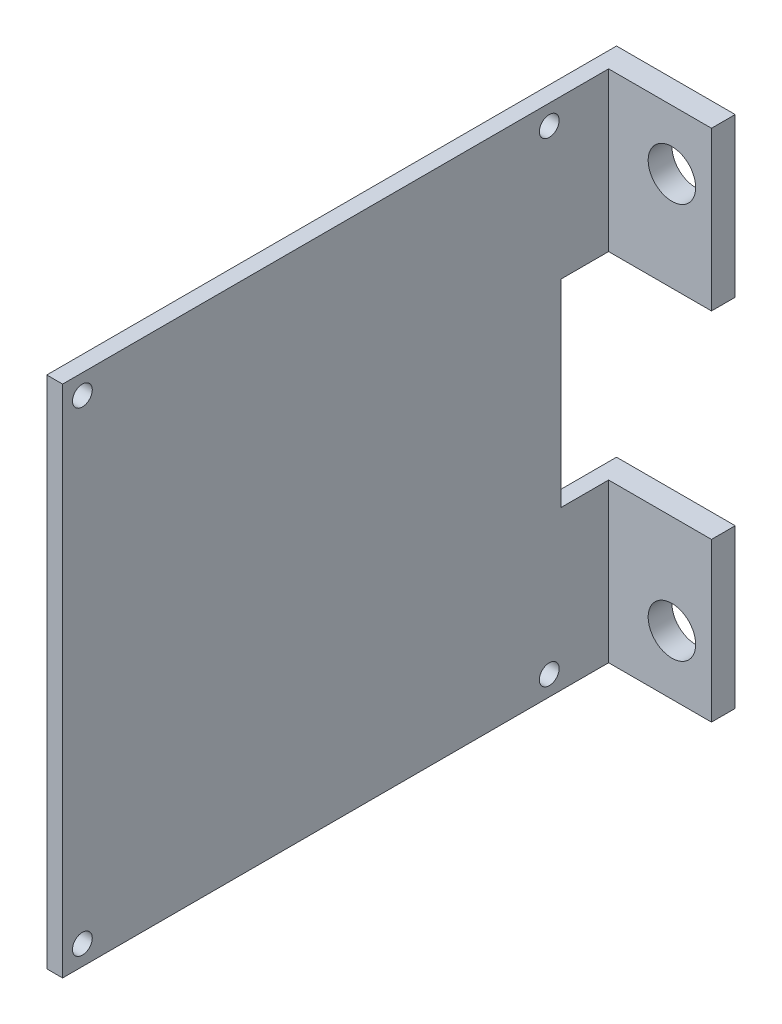
ISO-10303-21;
HEADER;
FILE_DESCRIPTION(('STEP AP214'),'2;1');
FILE_NAME('part.step','',(''),(''),'','','');
FILE_SCHEMA(('AUTOMOTIVE_DESIGN { 1 0 10303 214 1 1 1 1 }'));
ENDSEC;
DATA;
#1=APPLICATION_CONTEXT('core data for automotive mechanical design processes');
#2=APPLICATION_PROTOCOL_DEFINITION('international standard','automotive_design',2000,#1);
#3=PRODUCT_CONTEXT('',#1,'mechanical');
#4=PRODUCT('Part','Part','',(#3));
#5=PRODUCT_RELATED_PRODUCT_CATEGORY('part','',(#4));
#6=PRODUCT_DEFINITION_FORMATION('','',#4);
#7=PRODUCT_DEFINITION_CONTEXT('part definition',#1,'design');
#8=PRODUCT_DEFINITION('design','',#6,#7);
#9=PRODUCT_DEFINITION_SHAPE('','',#8);
#10=(LENGTH_UNIT() NAMED_UNIT(*) SI_UNIT(.MILLI.,.METRE.));
#11=(NAMED_UNIT(*) PLANE_ANGLE_UNIT() SI_UNIT($,.RADIAN.));
#12=(NAMED_UNIT(*) SI_UNIT($,.STERADIAN.) SOLID_ANGLE_UNIT());
#13=UNCERTAINTY_MEASURE_WITH_UNIT(LENGTH_MEASURE(1.E-05),#10,'distance_accuracy_value','');
#14=(GEOMETRIC_REPRESENTATION_CONTEXT(3) GLOBAL_UNCERTAINTY_ASSIGNED_CONTEXT((#13)) GLOBAL_UNIT_ASSIGNED_CONTEXT((#10,
#11,#12)) REPRESENTATION_CONTEXT('',''));
#15=CARTESIAN_POINT('',(0.,0.,0.));
#16=DIRECTION('',(0.,0.,1.));
#17=DIRECTION('',(1.,0.,0.));
#18=AXIS2_PLACEMENT_3D('',#15,#16,#17);
#19=CARTESIAN_POINT('',(0.,0.,3.));
#20=DIRECTION('',(0.,1.,0.));
#21=DIRECTION('',(0.,0.,1.));
#22=AXIS2_PLACEMENT_3D('',#19,#20,#21);
#23=PLANE('',#22);
#24=DIRECTION('',(1.,0.,0.));
#25=VECTOR('',#24,1.);
#26=CARTESIAN_POINT('',(0.,0.,0.));
#27=LINE('',#26,#25);
#28=CARTESIAN_POINT('',(0.,0.,0.));
#29=VERTEX_POINT('',#28);
#30=CARTESIAN_POINT('',(15.,0.,0.));
#31=VERTEX_POINT('',#30);
#32=EDGE_CURVE('E194',#29,#31,#27,.T.);
#33=ORIENTED_EDGE('',*,*,#32,.T.);
#34=DIRECTION('',(0.,0.,-1.));
#35=VECTOR('',#34,1.);
#36=CARTESIAN_POINT('',(15.,0.,3.));
#37=LINE('',#36,#35);
#38=CARTESIAN_POINT('',(15.,0.,3.));
#39=VERTEX_POINT('',#38);
#40=EDGE_CURVE('E11',#39,#31,#37,.T.);
#41=ORIENTED_EDGE('',*,*,#40,.F.);
#42=DIRECTION('',(1.,0.,0.));
#43=VECTOR('',#42,1.);
#44=CARTESIAN_POINT('',(0.,0.,3.));
#45=LINE('',#44,#43);
#46=CARTESIAN_POINT('',(2.,0.,3.));
#47=VERTEX_POINT('',#46);
#48=EDGE_CURVE('E204',#47,#39,#45,.T.);
#49=ORIENTED_EDGE('',*,*,#48,.F.);
#50=DIRECTION('',(0.,0.,-1.));
#51=VECTOR('',#50,1.);
#52=CARTESIAN_POINT('',(2.00000000000001,0.,72.));
#53=LINE('',#52,#51);
#54=CARTESIAN_POINT('',(2.00000000000001,0.,72.));
#55=VERTEX_POINT('',#54);
#56=EDGE_CURVE('E187',#55,#47,#53,.T.);
#57=ORIENTED_EDGE('',*,*,#56,.F.);
#58=DIRECTION('',(1.,0.,0.));
#59=VECTOR('',#58,1.);
#60=CARTESIAN_POINT('',(0.,0.,72.));
#61=LINE('',#60,#59);
#62=CARTESIAN_POINT('',(0.,0.,72.));
#63=VERTEX_POINT('',#62);
#64=EDGE_CURVE('E177',#63,#55,#61,.T.);
#65=ORIENTED_EDGE('',*,*,#64,.F.);
#66=DIRECTION('',(0.,0.,-1.));
#67=VECTOR('',#66,1.);
#68=CARTESIAN_POINT('',(0.,0.,3.));
#69=LINE('',#68,#67);
#70=EDGE_CURVE('E40',#63,#29,#69,.T.);
#71=ORIENTED_EDGE('',*,*,#70,.T.);
#72=EDGE_LOOP('',(#33,#41,#49,#57,#65,#71));
#73=FACE_BOUND('',#72,.T.);
#74=ADVANCED_FACE('F33',(#73),#23,.F.);
#75=CARTESIAN_POINT('',(0.,0.,3.));
#76=DIRECTION('',(0.,0.,1.));
#77=DIRECTION('',(1.,0.,0.));
#78=AXIS2_PLACEMENT_3D('',#75,#76,#77);
#79=PLANE('',#78);
#80=DIRECTION('',(0.,1.,0.));
#81=VECTOR('',#80,1.);
#82=CARTESIAN_POINT('',(2.,65.,3.));
#83=LINE('',#82,#81);
#84=CARTESIAN_POINT('',(2.00000000000001,20.,3.));
#85=VERTEX_POINT('',#84);
#86=EDGE_CURVE('E47',#47,#85,#83,.T.);
#87=ORIENTED_EDGE('',*,*,#86,.F.);
#88=ORIENTED_EDGE('',*,*,#48,.T.);
#89=DIRECTION('',(0.,1.,0.));
#90=VECTOR('',#89,1.);
#91=CARTESIAN_POINT('',(15.,0.,3.));
#92=LINE('',#91,#90);
#93=CARTESIAN_POINT('',(15.,20.,3.));
#94=VERTEX_POINT('',#93);
#95=EDGE_CURVE('E206',#39,#94,#92,.T.);
#96=ORIENTED_EDGE('',*,*,#95,.T.);
#97=DIRECTION('',(1.,0.,0.));
#98=VECTOR('',#97,1.);
#99=CARTESIAN_POINT('',(0.,20.,3.));
#100=LINE('',#99,#98);
#101=EDGE_CURVE('E190',#85,#94,#100,.T.);
#102=ORIENTED_EDGE('',*,*,#101,.F.);
#103=EDGE_LOOP('',(#87,#88,#96,#102));
#104=FACE_BOUND('',#103,.T.);
#105=CARTESIAN_POINT('',(10.,7.5,3.));
#106=DIRECTION('',(0.,0.,1.));
#107=DIRECTION('',(1.,0.,0.));
#108=AXIS2_PLACEMENT_3D('',#105,#106,#107);
#109=CIRCLE('',#108,3.);
#110=CARTESIAN_POINT('',(13.,7.5,3.));
#111=VERTEX_POINT('',#110);
#112=EDGE_CURVE('E195',#111,#111,#109,.T.);
#113=ORIENTED_EDGE('',*,*,#112,.F.);
#114=EDGE_LOOP('',(#113));
#115=FACE_BOUND('',#114,.T.);
#116=ADVANCED_FACE('F261',(#104,#115),#79,.T.);
#117=CARTESIAN_POINT('',(0.,0.,0.));
#118=DIRECTION('',(0.,0.,1.));
#119=DIRECTION('',(1.,0.,0.));
#120=AXIS2_PLACEMENT_3D('',#117,#118,#119);
#121=PLANE('',#120);
#122=CARTESIAN_POINT('',(10.,7.5,0.));
#123=DIRECTION('',(0.,0.,1.));
#124=DIRECTION('',(1.,0.,0.));
#125=AXIS2_PLACEMENT_3D('',#122,#123,#124);
#126=CIRCLE('',#125,3.);
#127=CARTESIAN_POINT('',(13.,7.5,0.));
#128=VERTEX_POINT('',#127);
#129=EDGE_CURVE('E191',#128,#128,#126,.T.);
#130=ORIENTED_EDGE('',*,*,#129,.T.);
#131=EDGE_LOOP('',(#130));
#132=FACE_BOUND('',#131,.T.);
#133=DIRECTION('',(0.,1.,0.));
#134=VECTOR('',#133,1.);
#135=CARTESIAN_POINT('',(0.,0.,0.));
#136=LINE('',#135,#134);
#137=CARTESIAN_POINT('',(0.,20.,0.));
#138=VERTEX_POINT('',#137);
#139=EDGE_CURVE('E207',#29,#138,#136,.T.);
#140=ORIENTED_EDGE('',*,*,#139,.T.);
#141=DIRECTION('',(1.,0.,0.));
#142=VECTOR('',#141,1.);
#143=CARTESIAN_POINT('',(0.,20.,0.));
#144=LINE('',#143,#142);
#145=CARTESIAN_POINT('',(15.,20.,0.));
#146=VERTEX_POINT('',#145);
#147=EDGE_CURVE('E198',#138,#146,#144,.T.);
#148=ORIENTED_EDGE('',*,*,#147,.T.);
#149=DIRECTION('',(0.,1.,0.));
#150=VECTOR('',#149,1.);
#151=CARTESIAN_POINT('',(15.,0.,0.));
#152=LINE('',#151,#150);
#153=EDGE_CURVE('E212',#31,#146,#152,.T.);
#154=ORIENTED_EDGE('',*,*,#153,.F.);
#155=ORIENTED_EDGE('',*,*,#32,.F.);
#156=EDGE_LOOP('',(#140,#148,#154,#155));
#157=FACE_BOUND('',#156,.T.);
#158=ADVANCED_FACE('F225',(#132,#157),#121,.F.);
#159=CARTESIAN_POINT('',(0.,0.,3.));
#160=DIRECTION('',(-1.,0.,0.));
#161=DIRECTION('',(0.,0.,1.));
#162=AXIS2_PLACEMENT_3D('',#159,#160,#161);
#163=PLANE('',#162);
#164=CARTESIAN_POINT('',(0.,62.5,10.5));
#165=DIRECTION('',(-1.,0.,0.));
#166=DIRECTION('',(0.,0.,1.));
#167=AXIS2_PLACEMENT_3D('',#164,#165,#166);
#168=CIRCLE('',#167,1.25);
#169=CARTESIAN_POINT('',(0.,62.5,11.75));
#170=VERTEX_POINT('',#169);
#171=EDGE_CURVE('E134',#170,#170,#168,.T.);
#172=ORIENTED_EDGE('',*,*,#171,.F.);
#173=EDGE_LOOP('',(#172));
#174=FACE_BOUND('',#173,.T.);
#175=CARTESIAN_POINT('',(0.,2.49999999999999,69.5));
#176=DIRECTION('',(-1.,0.,0.));
#177=DIRECTION('',(0.,0.,1.));
#178=AXIS2_PLACEMENT_3D('',#175,#176,#177);
#179=CIRCLE('',#178,1.25);
#180=CARTESIAN_POINT('',(0.,2.49999999999999,70.75));
#181=VERTEX_POINT('',#180);
#182=EDGE_CURVE('E351',#181,#181,#179,.T.);
#183=ORIENTED_EDGE('',*,*,#182,.F.);
#184=EDGE_LOOP('',(#183));
#185=FACE_BOUND('',#184,.T.);
#186=CARTESIAN_POINT('',(0.,2.5,10.5));
#187=DIRECTION('',(-1.,0.,0.));
#188=DIRECTION('',(0.,0.,1.));
#189=AXIS2_PLACEMENT_3D('',#186,#187,#188);
#190=CIRCLE('',#189,1.25);
#191=CARTESIAN_POINT('',(0.,2.5,11.75));
#192=VERTEX_POINT('',#191);
#193=EDGE_CURVE('E331',#192,#192,#190,.T.);
#194=ORIENTED_EDGE('',*,*,#193,.F.);
#195=EDGE_LOOP('',(#194));
#196=FACE_BOUND('',#195,.T.);
#197=CARTESIAN_POINT('',(0.,62.5,69.5));
#198=DIRECTION('',(-1.,0.,0.));
#199=DIRECTION('',(0.,0.,1.));
#200=AXIS2_PLACEMENT_3D('',#197,#198,#199);
#201=CIRCLE('',#200,1.25);
#202=CARTESIAN_POINT('',(0.,62.5,70.75));
#203=VERTEX_POINT('',#202);
#204=EDGE_CURVE('E347',#203,#203,#201,.T.);
#205=ORIENTED_EDGE('',*,*,#204,.F.);
#206=EDGE_LOOP('',(#205));
#207=FACE_BOUND('',#206,.T.);
#208=DIRECTION('',(0.,1.,0.));
#209=VECTOR('',#208,1.);
#210=CARTESIAN_POINT('',(0.,0.,9.));
#211=LINE('',#210,#209);
#212=CARTESIAN_POINT('',(0.,20.,9.));
#213=VERTEX_POINT('',#212);
#214=CARTESIAN_POINT('',(0.,45.,9.));
#215=VERTEX_POINT('',#214);
#216=EDGE_CURVE('E173',#213,#215,#211,.T.);
#217=ORIENTED_EDGE('',*,*,#216,.F.);
#218=DIRECTION('',(0.,0.,1.));
#219=VECTOR('',#218,1.);
#220=CARTESIAN_POINT('',(0.,20.,0.));
#221=LINE('',#220,#219);
#222=EDGE_CURVE('E200',#138,#213,#221,.T.);
#223=ORIENTED_EDGE('',*,*,#222,.F.);
#224=ORIENTED_EDGE('',*,*,#139,.F.);
#225=ORIENTED_EDGE('',*,*,#70,.F.);
#226=DIRECTION('',(0.,-1.,0.));
#227=VECTOR('',#226,1.);
#228=CARTESIAN_POINT('',(0.,65.,72.));
#229=LINE('',#228,#227);
#230=CARTESIAN_POINT('',(0.,65.,72.));
#231=VERTEX_POINT('',#230);
#232=EDGE_CURVE('E174',#231,#63,#229,.T.);
#233=ORIENTED_EDGE('',*,*,#232,.F.);
#234=DIRECTION('',(0.,0.,-1.));
#235=VECTOR('',#234,1.);
#236=CARTESIAN_POINT('',(0.,65.,72.));
#237=LINE('',#236,#235);
#238=CARTESIAN_POINT('',(0.,65.,0.));
#239=VERTEX_POINT('',#238);
#240=EDGE_CURVE('E182',#231,#239,#237,.T.);
#241=ORIENTED_EDGE('',*,*,#240,.T.);
#242=DIRECTION('',(0.,1.,0.));
#243=VECTOR('',#242,1.);
#244=CARTESIAN_POINT('',(0.,0.,0.));
#245=LINE('',#244,#243);
#246=CARTESIAN_POINT('',(0.,45.,0.));
#247=VERTEX_POINT('',#246);
#248=EDGE_CURVE('E160',#247,#239,#245,.T.);
#249=ORIENTED_EDGE('',*,*,#248,.F.);
#250=DIRECTION('',(0.,0.,1.));
#251=VECTOR('',#250,1.);
#252=CARTESIAN_POINT('',(0.,45.,0.));
#253=LINE('',#252,#251);
#254=EDGE_CURVE('E156',#247,#215,#253,.T.);
#255=ORIENTED_EDGE('',*,*,#254,.T.);
#256=EDGE_LOOP('',(#217,#223,#224,#225,#233,#241,#249,#255));
#257=FACE_BOUND('',#256,.T.);
#258=ADVANCED_FACE('F228',(#174,#185,#196,#207,#257),#163,.T.);
#259=CARTESIAN_POINT('',(15.,0.,3.));
#260=DIRECTION('',(-1.,0.,0.));
#261=DIRECTION('',(0.,0.,1.));
#262=AXIS2_PLACEMENT_3D('',#259,#260,#261);
#263=PLANE('',#262);
#264=ORIENTED_EDGE('',*,*,#153,.T.);
#265=DIRECTION('',(0.,0.,1.));
#266=VECTOR('',#265,1.);
#267=CARTESIAN_POINT('',(15.,20.,0.));
#268=LINE('',#267,#266);
#269=EDGE_CURVE('E55',#146,#94,#268,.T.);
#270=ORIENTED_EDGE('',*,*,#269,.T.);
#271=ORIENTED_EDGE('',*,*,#95,.F.);
#272=ORIENTED_EDGE('',*,*,#40,.T.);
#273=EDGE_LOOP('',(#264,#270,#271,#272));
#274=FACE_BOUND('',#273,.T.);
#275=ADVANCED_FACE('F264',(#274),#263,.F.);
#276=CARTESIAN_POINT('',(0.,20.,0.));
#277=DIRECTION('',(0.,-1.,0.));
#278=DIRECTION('',(0.,0.,-1.));
#279=AXIS2_PLACEMENT_3D('',#276,#277,#278);
#280=PLANE('',#279);
#281=ORIENTED_EDGE('',*,*,#222,.T.);
#282=DIRECTION('',(1.,0.,0.));
#283=VECTOR('',#282,1.);
#284=CARTESIAN_POINT('',(-67.,20.,9.));
#285=LINE('',#284,#283);
#286=CARTESIAN_POINT('',(2.00000000000001,20.,9.));
#287=VERTEX_POINT('',#286);
#288=EDGE_CURVE('E232',#213,#287,#285,.T.);
#289=ORIENTED_EDGE('',*,*,#288,.T.);
#290=DIRECTION('',(0.,0.,-1.));
#291=VECTOR('',#290,1.);
#292=CARTESIAN_POINT('',(2.00000000000001,20.,3.));
#293=LINE('',#292,#291);
#294=EDGE_CURVE('E238',#287,#85,#293,.T.);
#295=ORIENTED_EDGE('',*,*,#294,.T.);
#296=ORIENTED_EDGE('',*,*,#101,.T.);
#297=ORIENTED_EDGE('',*,*,#269,.F.);
#298=ORIENTED_EDGE('',*,*,#147,.F.);
#299=EDGE_LOOP('',(#281,#289,#295,#296,#297,#298));
#300=FACE_BOUND('',#299,.T.);
#301=ADVANCED_FACE('F231',(#300),#280,.F.);
#302=CARTESIAN_POINT('',(10.,7.5,0.));
#303=DIRECTION('',(0.,0.,1.));
#304=DIRECTION('',(1.,0.,0.));
#305=AXIS2_PLACEMENT_3D('',#302,#303,#304);
#306=CYLINDRICAL_SURFACE('',#305,3.);
#307=ORIENTED_EDGE('',*,*,#129,.F.);
#308=EDGE_LOOP('',(#307));
#309=FACE_BOUND('',#308,.T.);
#310=ORIENTED_EDGE('',*,*,#112,.T.);
#311=EDGE_LOOP('',(#310));
#312=FACE_BOUND('',#311,.T.);
#313=ADVANCED_FACE('F270',(#309,#312),#306,.F.);
#314=CARTESIAN_POINT('',(2.,65.,72.));
#315=DIRECTION('',(-1.,0.,0.));
#316=DIRECTION('',(0.,-1.,0.));
#317=AXIS2_PLACEMENT_3D('',#314,#315,#316);
#318=PLANE('',#317);
#319=CARTESIAN_POINT('',(2.,62.5,10.5));
#320=DIRECTION('',(1.,0.,0.));
#321=DIRECTION('',(0.,1.,0.));
#322=AXIS2_PLACEMENT_3D('',#319,#320,#321);
#323=CIRCLE('',#322,1.25);
#324=CARTESIAN_POINT('',(2.,63.75,10.5));
#325=VERTEX_POINT('',#324);
#326=EDGE_CURVE('E339',#325,#325,#323,.T.);
#327=ORIENTED_EDGE('',*,*,#326,.F.);
#328=EDGE_LOOP('',(#327));
#329=FACE_BOUND('',#328,.T.);
#330=CARTESIAN_POINT('',(2.00000000000001,2.49999999999999,69.5));
#331=DIRECTION('',(1.,0.,0.));
#332=DIRECTION('',(0.,1.,0.));
#333=AXIS2_PLACEMENT_3D('',#330,#331,#332);
#334=CIRCLE('',#333,1.25);
#335=CARTESIAN_POINT('',(2.00000000000001,3.74999999999999,69.5));
#336=VERTEX_POINT('',#335);
#337=EDGE_CURVE('E336',#336,#336,#334,.T.);
#338=ORIENTED_EDGE('',*,*,#337,.F.);
#339=EDGE_LOOP('',(#338));
#340=FACE_BOUND('',#339,.T.);
#341=CARTESIAN_POINT('',(2.00000000000001,2.5,10.5));
#342=DIRECTION('',(1.,0.,0.));
#343=DIRECTION('',(0.,1.,0.));
#344=AXIS2_PLACEMENT_3D('',#341,#342,#343);
#345=CIRCLE('',#344,1.25);
#346=CARTESIAN_POINT('',(2.00000000000001,3.75,10.5));
#347=VERTEX_POINT('',#346);
#348=EDGE_CURVE('E334',#347,#347,#345,.T.);
#349=ORIENTED_EDGE('',*,*,#348,.F.);
#350=EDGE_LOOP('',(#349));
#351=FACE_BOUND('',#350,.T.);
#352=CARTESIAN_POINT('',(2.,62.5,69.5));
#353=DIRECTION('',(1.,0.,0.));
#354=DIRECTION('',(0.,1.,0.));
#355=AXIS2_PLACEMENT_3D('',#352,#353,#354);
#356=CIRCLE('',#355,1.25);
#357=CARTESIAN_POINT('',(2.,63.75,69.5));
#358=VERTEX_POINT('',#357);
#359=EDGE_CURVE('E343',#358,#358,#356,.T.);
#360=ORIENTED_EDGE('',*,*,#359,.F.);
#361=EDGE_LOOP('',(#360));
#362=FACE_BOUND('',#361,.T.);
#363=ORIENTED_EDGE('',*,*,#86,.T.);
#364=ORIENTED_EDGE('',*,*,#294,.F.);
#365=DIRECTION('',(0.,-1.,0.));
#366=VECTOR('',#365,1.);
#367=CARTESIAN_POINT('',(2.00000000000001,45.,9.));
#368=LINE('',#367,#366);
#369=CARTESIAN_POINT('',(2.00000000000001,45.,9.));
#370=VERTEX_POINT('',#369);
#371=EDGE_CURVE('E130',#370,#287,#368,.T.);
#372=ORIENTED_EDGE('',*,*,#371,.F.);
#373=DIRECTION('',(0.,0.,1.));
#374=VECTOR('',#373,1.);
#375=CARTESIAN_POINT('',(2.00000000000001,45.,3.));
#376=LINE('',#375,#374);
#377=CARTESIAN_POINT('',(2.00000000000001,45.,3.));
#378=VERTEX_POINT('',#377);
#379=EDGE_CURVE('E122',#378,#370,#376,.T.);
#380=ORIENTED_EDGE('',*,*,#379,.F.);
#381=CARTESIAN_POINT('',(2.,65.,3.));
#382=VERTEX_POINT('',#381);
#383=EDGE_CURVE('E126',#378,#382,#83,.T.);
#384=ORIENTED_EDGE('',*,*,#383,.T.);
#385=DIRECTION('',(0.,0.,-1.));
#386=VECTOR('',#385,1.);
#387=CARTESIAN_POINT('',(2.,65.,72.));
#388=LINE('',#387,#386);
#389=CARTESIAN_POINT('',(2.,65.,72.));
#390=VERTEX_POINT('',#389);
#391=EDGE_CURVE('E185',#390,#382,#388,.T.);
#392=ORIENTED_EDGE('',*,*,#391,.F.);
#393=DIRECTION('',(0.,1.,0.));
#394=VECTOR('',#393,1.);
#395=CARTESIAN_POINT('',(2.,65.,72.));
#396=LINE('',#395,#394);
#397=EDGE_CURVE('E179',#55,#390,#396,.T.);
#398=ORIENTED_EDGE('',*,*,#397,.F.);
#399=ORIENTED_EDGE('',*,*,#56,.T.);
#400=EDGE_LOOP('',(#363,#364,#372,#380,#384,#392,#398,#399));
#401=FACE_BOUND('',#400,.T.);
#402=ADVANCED_FACE('F124',(#329,#340,#351,#362,#401),#318,.F.);
#403=CARTESIAN_POINT('',(0.,65.,72.));
#404=DIRECTION('',(0.,-1.,0.));
#405=DIRECTION('',(0.,0.,-1.));
#406=AXIS2_PLACEMENT_3D('',#403,#404,#405);
#407=PLANE('',#406);
#408=ORIENTED_EDGE('',*,*,#391,.T.);
#409=DIRECTION('',(1.,0.,0.));
#410=VECTOR('',#409,1.);
#411=CARTESIAN_POINT('',(0.,65.,3.));
#412=LINE('',#411,#410);
#413=CARTESIAN_POINT('',(15.,65.,3.));
#414=VERTEX_POINT('',#413);
#415=EDGE_CURVE('E143',#382,#414,#412,.T.);
#416=ORIENTED_EDGE('',*,*,#415,.T.);
#417=DIRECTION('',(0.,0.,-1.));
#418=VECTOR('',#417,1.);
#419=CARTESIAN_POINT('',(15.,65.,3.));
#420=LINE('',#419,#418);
#421=CARTESIAN_POINT('',(15.,65.,0.));
#422=VERTEX_POINT('',#421);
#423=EDGE_CURVE('E149',#414,#422,#420,.T.);
#424=ORIENTED_EDGE('',*,*,#423,.T.);
#425=DIRECTION('',(1.,0.,0.));
#426=VECTOR('',#425,1.);
#427=CARTESIAN_POINT('',(0.,65.,0.));
#428=LINE('',#427,#426);
#429=EDGE_CURVE('E170',#239,#422,#428,.T.);
#430=ORIENTED_EDGE('',*,*,#429,.F.);
#431=ORIENTED_EDGE('',*,*,#240,.F.);
#432=DIRECTION('',(-1.,0.,0.));
#433=VECTOR('',#432,1.);
#434=CARTESIAN_POINT('',(0.,65.,72.));
#435=LINE('',#434,#433);
#436=EDGE_CURVE('E181',#390,#231,#435,.T.);
#437=ORIENTED_EDGE('',*,*,#436,.F.);
#438=EDGE_LOOP('',(#408,#416,#424,#430,#431,#437));
#439=FACE_BOUND('',#438,.T.);
#440=ADVANCED_FACE('F246',(#439),#407,.F.);
#441=CARTESIAN_POINT('',(0.,0.,72.));
#442=DIRECTION('',(0.,0.,1.));
#443=DIRECTION('',(1.,0.,0.));
#444=AXIS2_PLACEMENT_3D('',#441,#442,#443);
#445=PLANE('',#444);
#446=ORIENTED_EDGE('',*,*,#232,.T.);
#447=ORIENTED_EDGE('',*,*,#64,.T.);
#448=ORIENTED_EDGE('',*,*,#397,.T.);
#449=ORIENTED_EDGE('',*,*,#436,.T.);
#450=EDGE_LOOP('',(#446,#447,#448,#449));
#451=FACE_BOUND('',#450,.T.);
#452=ADVANCED_FACE('F258',(#451),#445,.T.);
#453=CARTESIAN_POINT('',(0.,0.,3.));
#454=DIRECTION('',(0.,0.,1.));
#455=DIRECTION('',(1.,0.,0.));
#456=AXIS2_PLACEMENT_3D('',#453,#454,#455);
#457=PLANE('',#456);
#458=CARTESIAN_POINT('',(10.,57.5,3.));
#459=DIRECTION('',(0.,0.,1.));
#460=DIRECTION('',(1.,0.,0.));
#461=AXIS2_PLACEMENT_3D('',#458,#459,#460);
#462=CIRCLE('',#461,3.);
#463=CARTESIAN_POINT('',(13.,57.5,3.));
#464=VERTEX_POINT('',#463);
#465=EDGE_CURVE('E144',#464,#464,#462,.T.);
#466=ORIENTED_EDGE('',*,*,#465,.F.);
#467=EDGE_LOOP('',(#466));
#468=FACE_BOUND('',#467,.T.);
#469=ORIENTED_EDGE('',*,*,#383,.F.);
#470=DIRECTION('',(-1.,0.,0.));
#471=VECTOR('',#470,1.);
#472=CARTESIAN_POINT('',(0.,45.,3.));
#473=LINE('',#472,#471);
#474=CARTESIAN_POINT('',(15.,45.,3.));
#475=VERTEX_POINT('',#474);
#476=EDGE_CURVE('E141',#475,#378,#473,.T.);
#477=ORIENTED_EDGE('',*,*,#476,.F.);
#478=DIRECTION('',(0.,1.,0.));
#479=VECTOR('',#478,1.);
#480=CARTESIAN_POINT('',(15.,0.,3.));
#481=LINE('',#480,#479);
#482=EDGE_CURVE('E166',#475,#414,#481,.T.);
#483=ORIENTED_EDGE('',*,*,#482,.T.);
#484=ORIENTED_EDGE('',*,*,#415,.F.);
#485=EDGE_LOOP('',(#469,#477,#483,#484));
#486=FACE_BOUND('',#485,.T.);
#487=ADVANCED_FACE('F139',(#468,#486),#457,.T.);
#488=CARTESIAN_POINT('',(15.,0.,3.));
#489=DIRECTION('',(-1.,0.,0.));
#490=DIRECTION('',(0.,0.,1.));
#491=AXIS2_PLACEMENT_3D('',#488,#489,#490);
#492=PLANE('',#491);
#493=ORIENTED_EDGE('',*,*,#482,.F.);
#494=DIRECTION('',(0.,0.,1.));
#495=VECTOR('',#494,1.);
#496=CARTESIAN_POINT('',(15.,45.,0.));
#497=LINE('',#496,#495);
#498=CARTESIAN_POINT('',(15.,45.,0.));
#499=VERTEX_POINT('',#498);
#500=EDGE_CURVE('E148',#499,#475,#497,.T.);
#501=ORIENTED_EDGE('',*,*,#500,.F.);
#502=DIRECTION('',(0.,1.,0.));
#503=VECTOR('',#502,1.);
#504=CARTESIAN_POINT('',(15.,0.,0.));
#505=LINE('',#504,#503);
#506=EDGE_CURVE('E171',#499,#422,#505,.T.);
#507=ORIENTED_EDGE('',*,*,#506,.T.);
#508=ORIENTED_EDGE('',*,*,#423,.F.);
#509=EDGE_LOOP('',(#493,#501,#507,#508));
#510=FACE_BOUND('',#509,.T.);
#511=ADVANCED_FACE('F251',(#510),#492,.F.);
#512=CARTESIAN_POINT('',(0.,0.,0.));
#513=DIRECTION('',(0.,0.,1.));
#514=DIRECTION('',(1.,0.,0.));
#515=AXIS2_PLACEMENT_3D('',#512,#513,#514);
#516=PLANE('',#515);
#517=CARTESIAN_POINT('',(10.,57.5,0.));
#518=DIRECTION('',(0.,0.,1.));
#519=DIRECTION('',(1.,0.,0.));
#520=AXIS2_PLACEMENT_3D('',#517,#518,#519);
#521=CIRCLE('',#520,3.);
#522=CARTESIAN_POINT('',(13.,57.5,0.));
#523=VERTEX_POINT('',#522);
#524=EDGE_CURVE('E161',#523,#523,#521,.T.);
#525=ORIENTED_EDGE('',*,*,#524,.T.);
#526=EDGE_LOOP('',(#525));
#527=FACE_BOUND('',#526,.T.);
#528=ORIENTED_EDGE('',*,*,#506,.F.);
#529=DIRECTION('',(-1.,0.,0.));
#530=VECTOR('',#529,1.);
#531=CARTESIAN_POINT('',(0.,45.,0.));
#532=LINE('',#531,#530);
#533=EDGE_CURVE('E157',#499,#247,#532,.T.);
#534=ORIENTED_EDGE('',*,*,#533,.T.);
#535=ORIENTED_EDGE('',*,*,#248,.T.);
#536=ORIENTED_EDGE('',*,*,#429,.T.);
#537=EDGE_LOOP('',(#528,#534,#535,#536));
#538=FACE_BOUND('',#537,.T.);
#539=ADVANCED_FACE('F254',(#527,#538),#516,.F.);
#540=CARTESIAN_POINT('',(0.,45.,0.));
#541=DIRECTION('',(0.,1.,0.));
#542=DIRECTION('',(0.,0.,1.));
#543=AXIS2_PLACEMENT_3D('',#540,#541,#542);
#544=PLANE('',#543);
#545=ORIENTED_EDGE('',*,*,#476,.T.);
#546=ORIENTED_EDGE('',*,*,#379,.T.);
#547=DIRECTION('',(1.,0.,0.));
#548=VECTOR('',#547,1.);
#549=CARTESIAN_POINT('',(-67.,45.,9.));
#550=LINE('',#549,#548);
#551=EDGE_CURVE('E235',#215,#370,#550,.T.);
#552=ORIENTED_EDGE('',*,*,#551,.F.);
#553=ORIENTED_EDGE('',*,*,#254,.F.);
#554=ORIENTED_EDGE('',*,*,#533,.F.);
#555=ORIENTED_EDGE('',*,*,#500,.T.);
#556=EDGE_LOOP('',(#545,#546,#552,#553,#554,#555));
#557=FACE_BOUND('',#556,.T.);
#558=ADVANCED_FACE('F146',(#557),#544,.F.);
#559=CARTESIAN_POINT('',(10.,57.5,0.));
#560=DIRECTION('',(0.,0.,1.));
#561=DIRECTION('',(1.,0.,0.));
#562=AXIS2_PLACEMENT_3D('',#559,#560,#561);
#563=CYLINDRICAL_SURFACE('',#562,3.);
#564=ORIENTED_EDGE('',*,*,#524,.F.);
#565=EDGE_LOOP('',(#564));
#566=FACE_BOUND('',#565,.T.);
#567=ORIENTED_EDGE('',*,*,#465,.T.);
#568=EDGE_LOOP('',(#567));
#569=FACE_BOUND('',#568,.T.);
#570=ADVANCED_FACE('F303',(#566,#569),#563,.F.);
#571=CARTESIAN_POINT('',(-67.,45.,9.));
#572=DIRECTION('',(0.,0.,1.));
#573=DIRECTION('',(0.,-1.,0.));
#574=AXIS2_PLACEMENT_3D('',#571,#572,#573);
#575=PLANE('',#574);
#576=ORIENTED_EDGE('',*,*,#216,.T.);
#577=ORIENTED_EDGE('',*,*,#551,.T.);
#578=ORIENTED_EDGE('',*,*,#371,.T.);
#579=ORIENTED_EDGE('',*,*,#288,.F.);
#580=EDGE_LOOP('',(#576,#577,#578,#579));
#581=FACE_BOUND('',#580,.T.);
#582=ADVANCED_FACE('F234',(#581),#575,.F.);
#583=CARTESIAN_POINT('',(-67.,62.5,69.5));
#584=DIRECTION('',(1.,0.,0.));
#585=DIRECTION('',(0.,1.,0.));
#586=AXIS2_PLACEMENT_3D('',#583,#584,#585);
#587=CYLINDRICAL_SURFACE('',#586,1.25);
#588=ORIENTED_EDGE('',*,*,#204,.T.);
#589=EDGE_LOOP('',(#588));
#590=FACE_BOUND('',#589,.T.);
#591=ORIENTED_EDGE('',*,*,#359,.T.);
#592=EDGE_LOOP('',(#591));
#593=FACE_BOUND('',#592,.T.);
#594=ADVANCED_FACE('F311',(#590,#593),#587,.F.);
#595=CARTESIAN_POINT('',(-67.,2.49999999999999,10.5));
#596=DIRECTION('',(1.,0.,0.));
#597=DIRECTION('',(0.,1.,0.));
#598=AXIS2_PLACEMENT_3D('',#595,#596,#597);
#599=CYLINDRICAL_SURFACE('',#598,1.25);
#600=ORIENTED_EDGE('',*,*,#193,.T.);
#601=EDGE_LOOP('',(#600));
#602=FACE_BOUND('',#601,.T.);
#603=ORIENTED_EDGE('',*,*,#348,.T.);
#604=EDGE_LOOP('',(#603));
#605=FACE_BOUND('',#604,.T.);
#606=ADVANCED_FACE('F314',(#602,#605),#599,.F.);
#607=CARTESIAN_POINT('',(-67.,2.49999999999998,69.5));
#608=DIRECTION('',(1.,0.,0.));
#609=DIRECTION('',(0.,1.,0.));
#610=AXIS2_PLACEMENT_3D('',#607,#608,#609);
#611=CYLINDRICAL_SURFACE('',#610,1.25);
#612=ORIENTED_EDGE('',*,*,#182,.T.);
#613=EDGE_LOOP('',(#612));
#614=FACE_BOUND('',#613,.T.);
#615=ORIENTED_EDGE('',*,*,#337,.T.);
#616=EDGE_LOOP('',(#615));
#617=FACE_BOUND('',#616,.T.);
#618=ADVANCED_FACE('F316',(#614,#617),#611,.F.);
#619=CARTESIAN_POINT('',(-67.,62.5,10.5));
#620=DIRECTION('',(1.,0.,0.));
#621=DIRECTION('',(0.,1.,0.));
#622=AXIS2_PLACEMENT_3D('',#619,#620,#621);
#623=CYLINDRICAL_SURFACE('',#622,1.25);
#624=ORIENTED_EDGE('',*,*,#171,.T.);
#625=EDGE_LOOP('',(#624));
#626=FACE_BOUND('',#625,.T.);
#627=ORIENTED_EDGE('',*,*,#326,.T.);
#628=EDGE_LOOP('',(#627));
#629=FACE_BOUND('',#628,.T.);
#630=ADVANCED_FACE('F319',(#626,#629),#623,.F.);
#631=CLOSED_SHELL('',(#74,#116,#158,#258,#275,#301,#313,#402,#440,#452,#487,#511,#539,#558,#570,
#582,#594,#606,#618,#630));
#632=MANIFOLD_SOLID_BREP('B2',#631);
#633=ADVANCED_BREP_SHAPE_REPRESENTATION('',(#18,#632),#14);
#634=SHAPE_DEFINITION_REPRESENTATION(#9,#633);
ENDSEC;
END-ISO-10303-21;
